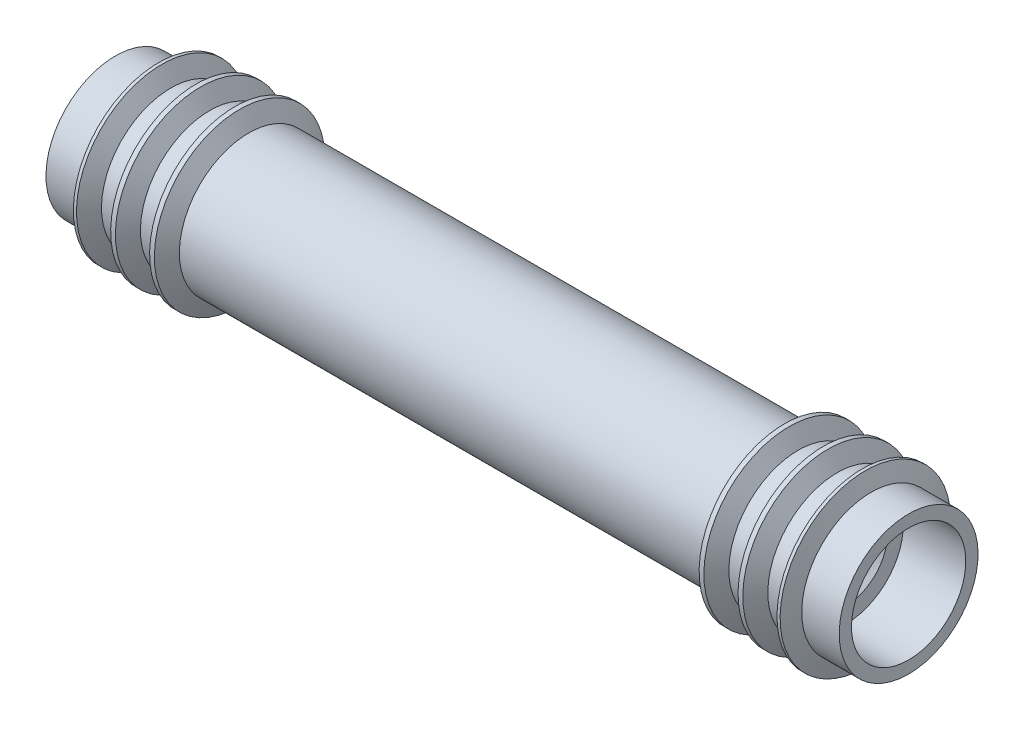
ISO-10303-21;
HEADER;
FILE_DESCRIPTION(('STEP AP214'),'2;1');
FILE_NAME('part.step','',(''),(''),'','','');
FILE_SCHEMA(('AUTOMOTIVE_DESIGN { 1 0 10303 214 1 1 1 1 }'));
ENDSEC;
DATA;
#1=APPLICATION_CONTEXT('core data for automotive mechanical design processes');
#2=APPLICATION_PROTOCOL_DEFINITION('international standard','automotive_design',2000,#1);
#3=PRODUCT_CONTEXT('',#1,'mechanical');
#4=PRODUCT('Part','Part','',(#3));
#5=PRODUCT_RELATED_PRODUCT_CATEGORY('part','',(#4));
#6=PRODUCT_DEFINITION_FORMATION('','',#4);
#7=PRODUCT_DEFINITION_CONTEXT('part definition',#1,'design');
#8=PRODUCT_DEFINITION('design','',#6,#7);
#9=PRODUCT_DEFINITION_SHAPE('','',#8);
#10=(LENGTH_UNIT() NAMED_UNIT(*) SI_UNIT(.MILLI.,.METRE.));
#11=(NAMED_UNIT(*) PLANE_ANGLE_UNIT() SI_UNIT($,.RADIAN.));
#12=(NAMED_UNIT(*) SI_UNIT($,.STERADIAN.) SOLID_ANGLE_UNIT());
#13=UNCERTAINTY_MEASURE_WITH_UNIT(LENGTH_MEASURE(1.E-05),#10,'distance_accuracy_value','');
#14=(GEOMETRIC_REPRESENTATION_CONTEXT(3) GLOBAL_UNCERTAINTY_ASSIGNED_CONTEXT((#13)) GLOBAL_UNIT_ASSIGNED_CONTEXT((#10,
#11,#12)) REPRESENTATION_CONTEXT('',''));
#15=CARTESIAN_POINT('',(0.,0.,0.));
#16=DIRECTION('',(0.,0.,1.));
#17=DIRECTION('',(1.,0.,0.));
#18=AXIS2_PLACEMENT_3D('',#15,#16,#17);
#19=CARTESIAN_POINT('',(-31.75,0.,0.));
#20=DIRECTION('',(-1.,0.,0.));
#21=DIRECTION('',(0.,-1.,0.));
#22=AXIS2_PLACEMENT_3D('',#19,#20,#21);
#23=CYLINDRICAL_SURFACE('',#22,5.55625);
#24=CARTESIAN_POINT('',(-21.0700606325167,0.,0.));
#25=DIRECTION('',(-1.,0.,0.));
#26=DIRECTION('',(0.,-1.,0.));
#27=AXIS2_PLACEMENT_3D('',#24,#25,#26);
#28=CIRCLE('',#27,5.55625);
#29=CARTESIAN_POINT('',(-21.0700606325167,-5.55625,0.));
#30=VERTEX_POINT('',#29);
#31=EDGE_CURVE('E61',#30,#30,#28,.T.);
#32=ORIENTED_EDGE('',*,*,#31,.F.);
#33=EDGE_LOOP('',(#32));
#34=FACE_BOUND('',#33,.T.);
#35=CARTESIAN_POINT('',(21.0700606325167,0.,0.));
#36=DIRECTION('',(-1.,0.,0.));
#37=DIRECTION('',(0.,-1.,0.));
#38=AXIS2_PLACEMENT_3D('',#35,#36,#37);
#39=CIRCLE('',#38,5.55625);
#40=CARTESIAN_POINT('',(21.0700606325167,-5.55625,0.));
#41=VERTEX_POINT('',#40);
#42=EDGE_CURVE('E136',#41,#41,#39,.T.);
#43=ORIENTED_EDGE('',*,*,#42,.T.);
#44=EDGE_LOOP('',(#43));
#45=FACE_BOUND('',#44,.T.);
#46=ADVANCED_FACE('F47',(#34,#45),#23,.T.);
#47=CARTESIAN_POINT('',(-21.8032954743875,0.,0.));
#48=DIRECTION('',(-1.,0.,0.));
#49=DIRECTION('',(0.,-1.,0.));
#50=AXIS2_PLACEMENT_3D('',#47,#48,#49);
#51=CONICAL_SURFACE('',#50,6.82625,1.0471975511966);
#52=ORIENTED_EDGE('',*,*,#31,.T.);
#53=EDGE_LOOP('',(#52));
#54=FACE_BOUND('',#53,.T.);
#55=CARTESIAN_POINT('',(-21.8032954743875,0.,0.));
#56=DIRECTION('',(-1.,0.,0.));
#57=DIRECTION('',(0.,-1.,0.));
#58=AXIS2_PLACEMENT_3D('',#55,#56,#57);
#59=CIRCLE('',#58,6.82625);
#60=CARTESIAN_POINT('',(-21.8032954743875,-6.82625,0.));
#61=VERTEX_POINT('',#60);
#62=EDGE_CURVE('E66',#61,#61,#59,.T.);
#63=ORIENTED_EDGE('',*,*,#62,.F.);
#64=EDGE_LOOP('',(#63));
#65=FACE_BOUND('',#64,.T.);
#66=ADVANCED_FACE('F228',(#54,#65),#51,.T.);
#67=CARTESIAN_POINT('',(-31.75,0.,0.));
#68=DIRECTION('',(-1.,0.,0.));
#69=DIRECTION('',(0.,-1.,0.));
#70=AXIS2_PLACEMENT_3D('',#67,#68,#69);
#71=CYLINDRICAL_SURFACE('',#70,6.82625);
#72=ORIENTED_EDGE('',*,*,#62,.T.);
#73=EDGE_LOOP('',(#72));
#74=FACE_BOUND('',#73,.T.);
#75=CARTESIAN_POINT('',(-22.1842954743875,0.,0.));
#76=DIRECTION('',(-1.,0.,0.));
#77=DIRECTION('',(0.,-1.,0.));
#78=AXIS2_PLACEMENT_3D('',#75,#76,#77);
#79=CIRCLE('',#78,6.82625);
#80=CARTESIAN_POINT('',(-22.1842954743875,-6.82625,0.));
#81=VERTEX_POINT('',#80);
#82=EDGE_CURVE('E72',#81,#81,#79,.T.);
#83=ORIENTED_EDGE('',*,*,#82,.F.);
#84=EDGE_LOOP('',(#83));
#85=FACE_BOUND('',#84,.T.);
#86=ADVANCED_FACE('F235',(#74,#85),#71,.T.);
#87=CARTESIAN_POINT('',(-22.9175303162584,0.,0.));
#88=DIRECTION('',(1.,0.,0.));
#89=DIRECTION('',(0.,1.,0.));
#90=AXIS2_PLACEMENT_3D('',#87,#88,#89);
#91=CONICAL_SURFACE('',#90,5.55625,1.0471975511966);
#92=ORIENTED_EDGE('',*,*,#82,.T.);
#93=EDGE_LOOP('',(#92));
#94=FACE_BOUND('',#93,.T.);
#95=CARTESIAN_POINT('',(-22.9175303162584,0.,0.));
#96=DIRECTION('',(-1.,0.,0.));
#97=DIRECTION('',(0.,-1.,0.));
#98=AXIS2_PLACEMENT_3D('',#95,#96,#97);
#99=CIRCLE('',#98,5.55625);
#100=CARTESIAN_POINT('',(-22.9175303162584,-5.55625,0.));
#101=VERTEX_POINT('',#100);
#102=EDGE_CURVE('E76',#101,#101,#99,.T.);
#103=ORIENTED_EDGE('',*,*,#102,.F.);
#104=EDGE_LOOP('',(#103));
#105=FACE_BOUND('',#104,.T.);
#106=ADVANCED_FACE('F243',(#94,#105),#91,.T.);
#107=CARTESIAN_POINT('',(-31.75,0.,0.));
#108=DIRECTION('',(-1.,0.,0.));
#109=DIRECTION('',(0.,-1.,0.));
#110=AXIS2_PLACEMENT_3D('',#107,#108,#109);
#111=CYLINDRICAL_SURFACE('',#110,5.55625);
#112=ORIENTED_EDGE('',*,*,#102,.T.);
#113=EDGE_LOOP('',(#112));
#114=FACE_BOUND('',#113,.T.);
#115=CARTESIAN_POINT('',(-24.1875303162583,0.,0.));
#116=DIRECTION('',(-1.,0.,0.));
#117=DIRECTION('',(0.,-1.,0.));
#118=AXIS2_PLACEMENT_3D('',#115,#116,#117);
#119=CIRCLE('',#118,5.55625);
#120=CARTESIAN_POINT('',(-24.1875303162583,-5.55625,0.));
#121=VERTEX_POINT('',#120);
#122=EDGE_CURVE('E80',#121,#121,#119,.T.);
#123=ORIENTED_EDGE('',*,*,#122,.F.);
#124=EDGE_LOOP('',(#123));
#125=FACE_BOUND('',#124,.T.);
#126=ADVANCED_FACE('F247',(#114,#125),#111,.T.);
#127=CARTESIAN_POINT('',(-24.9207651581292,0.,0.));
#128=DIRECTION('',(-1.,0.,0.));
#129=DIRECTION('',(0.,-1.,0.));
#130=AXIS2_PLACEMENT_3D('',#127,#128,#129);
#131=CONICAL_SURFACE('',#130,6.82625,1.0471975511966);
#132=ORIENTED_EDGE('',*,*,#122,.T.);
#133=EDGE_LOOP('',(#132));
#134=FACE_BOUND('',#133,.T.);
#135=CARTESIAN_POINT('',(-24.9207651581292,0.,0.));
#136=DIRECTION('',(-1.,0.,0.));
#137=DIRECTION('',(0.,-1.,0.));
#138=AXIS2_PLACEMENT_3D('',#135,#136,#137);
#139=CIRCLE('',#138,6.82625);
#140=CARTESIAN_POINT('',(-24.9207651581292,-6.82625,0.));
#141=VERTEX_POINT('',#140);
#142=EDGE_CURVE('E84',#141,#141,#139,.T.);
#143=ORIENTED_EDGE('',*,*,#142,.F.);
#144=EDGE_LOOP('',(#143));
#145=FACE_BOUND('',#144,.T.);
#146=ADVANCED_FACE('F251',(#134,#145),#131,.T.);
#147=CARTESIAN_POINT('',(-31.75,0.,0.));
#148=DIRECTION('',(-1.,0.,0.));
#149=DIRECTION('',(0.,-1.,0.));
#150=AXIS2_PLACEMENT_3D('',#147,#148,#149);
#151=CYLINDRICAL_SURFACE('',#150,6.82625);
#152=ORIENTED_EDGE('',*,*,#142,.T.);
#153=EDGE_LOOP('',(#152));
#154=FACE_BOUND('',#153,.T.);
#155=CARTESIAN_POINT('',(-25.3017651581292,0.,0.));
#156=DIRECTION('',(-1.,0.,0.));
#157=DIRECTION('',(0.,-1.,0.));
#158=AXIS2_PLACEMENT_3D('',#155,#156,#157);
#159=CIRCLE('',#158,6.82625);
#160=CARTESIAN_POINT('',(-25.3017651581292,-6.82625,0.));
#161=VERTEX_POINT('',#160);
#162=EDGE_CURVE('E88',#161,#161,#159,.T.);
#163=ORIENTED_EDGE('',*,*,#162,.F.);
#164=EDGE_LOOP('',(#163));
#165=FACE_BOUND('',#164,.T.);
#166=ADVANCED_FACE('F255',(#154,#165),#151,.T.);
#167=CARTESIAN_POINT('',(-25.3017651581292,0.,0.));
#168=DIRECTION('',(1.,0.,0.));
#169=DIRECTION('',(0.,1.,0.));
#170=AXIS2_PLACEMENT_3D('',#167,#168,#169);
#171=CONICAL_SURFACE('',#170,6.82625,1.0471975511966);
#172=CARTESIAN_POINT('',(-26.035,0.,0.));
#173=DIRECTION('',(-1.,0.,0.));
#174=DIRECTION('',(0.,-1.,0.));
#175=AXIS2_PLACEMENT_3D('',#172,#173,#174);
#176=CIRCLE('',#175,5.55625);
#177=CARTESIAN_POINT('',(-26.035,-5.55625,0.));
#178=VERTEX_POINT('',#177);
#179=EDGE_CURVE('E92',#178,#178,#176,.T.);
#180=ORIENTED_EDGE('',*,*,#179,.F.);
#181=EDGE_LOOP('',(#180));
#182=FACE_BOUND('',#181,.T.);
#183=ORIENTED_EDGE('',*,*,#162,.T.);
#184=EDGE_LOOP('',(#183));
#185=FACE_BOUND('',#184,.T.);
#186=ADVANCED_FACE('F259',(#182,#185),#171,.T.);
#187=CARTESIAN_POINT('',(-31.75,0.,0.));
#188=DIRECTION('',(-1.,0.,0.));
#189=DIRECTION('',(0.,-1.,0.));
#190=AXIS2_PLACEMENT_3D('',#187,#188,#189);
#191=CYLINDRICAL_SURFACE('',#190,5.55625);
#192=ORIENTED_EDGE('',*,*,#179,.T.);
#193=EDGE_LOOP('',(#192));
#194=FACE_BOUND('',#193,.T.);
#195=CARTESIAN_POINT('',(-27.305,0.,0.));
#196=DIRECTION('',(-1.,0.,0.));
#197=DIRECTION('',(0.,-1.,0.));
#198=AXIS2_PLACEMENT_3D('',#195,#196,#197);
#199=CIRCLE('',#198,5.55625);
#200=CARTESIAN_POINT('',(-27.305,-5.55625,0.));
#201=VERTEX_POINT('',#200);
#202=EDGE_CURVE('E96',#201,#201,#199,.T.);
#203=ORIENTED_EDGE('',*,*,#202,.F.);
#204=EDGE_LOOP('',(#203));
#205=FACE_BOUND('',#204,.T.);
#206=ADVANCED_FACE('F263',(#194,#205),#191,.T.);
#207=CARTESIAN_POINT('',(-28.0382348418708,0.,0.));
#208=DIRECTION('',(-1.,0.,0.));
#209=DIRECTION('',(0.,-1.,0.));
#210=AXIS2_PLACEMENT_3D('',#207,#208,#209);
#211=CONICAL_SURFACE('',#210,6.82625,1.0471975511966);
#212=ORIENTED_EDGE('',*,*,#202,.T.);
#213=EDGE_LOOP('',(#212));
#214=FACE_BOUND('',#213,.T.);
#215=CARTESIAN_POINT('',(-28.0382348418708,0.,0.));
#216=DIRECTION('',(-1.,0.,0.));
#217=DIRECTION('',(0.,-1.,0.));
#218=AXIS2_PLACEMENT_3D('',#215,#216,#217);
#219=CIRCLE('',#218,6.82625);
#220=CARTESIAN_POINT('',(-28.0382348418708,-6.82625,0.));
#221=VERTEX_POINT('',#220);
#222=EDGE_CURVE('E100',#221,#221,#219,.T.);
#223=ORIENTED_EDGE('',*,*,#222,.F.);
#224=EDGE_LOOP('',(#223));
#225=FACE_BOUND('',#224,.T.);
#226=ADVANCED_FACE('F267',(#214,#225),#211,.T.);
#227=CARTESIAN_POINT('',(-31.75,0.,0.));
#228=DIRECTION('',(-1.,0.,0.));
#229=DIRECTION('',(0.,-1.,0.));
#230=AXIS2_PLACEMENT_3D('',#227,#228,#229);
#231=CYLINDRICAL_SURFACE('',#230,6.82625);
#232=ORIENTED_EDGE('',*,*,#222,.T.);
#233=EDGE_LOOP('',(#232));
#234=FACE_BOUND('',#233,.T.);
#235=CARTESIAN_POINT('',(-28.2877578024819,0.,0.));
#236=DIRECTION('',(-1.,0.,0.));
#237=DIRECTION('',(0.,-1.,0.));
#238=AXIS2_PLACEMENT_3D('',#235,#236,#237);
#239=CIRCLE('',#238,6.82625);
#240=CARTESIAN_POINT('',(-28.2877578024819,-6.82625,0.));
#241=VERTEX_POINT('',#240);
#242=EDGE_CURVE('E104',#241,#241,#239,.T.);
#243=ORIENTED_EDGE('',*,*,#242,.F.);
#244=EDGE_LOOP('',(#243));
#245=FACE_BOUND('',#244,.T.);
#246=ADVANCED_FACE('F271',(#234,#245),#231,.T.);
#247=CARTESIAN_POINT('',(-28.75,0.,0.));
#248=DIRECTION('',(1.,0.,0.));
#249=DIRECTION('',(0.,1.,0.));
#250=AXIS2_PLACEMENT_3D('',#247,#248,#249);
#251=CONICAL_SURFACE('',#250,5.55625,1.22173047639603);
#252=ORIENTED_EDGE('',*,*,#242,.T.);
#253=EDGE_LOOP('',(#252));
#254=FACE_BOUND('',#253,.T.);
#255=CARTESIAN_POINT('',(-28.75,0.,0.));
#256=DIRECTION('',(-1.,0.,0.));
#257=DIRECTION('',(0.,-1.,0.));
#258=AXIS2_PLACEMENT_3D('',#255,#256,#257);
#259=CIRCLE('',#258,5.55625);
#260=CARTESIAN_POINT('',(-28.75,-5.55625,0.));
#261=VERTEX_POINT('',#260);
#262=EDGE_CURVE('E108',#261,#261,#259,.T.);
#263=ORIENTED_EDGE('',*,*,#262,.F.);
#264=EDGE_LOOP('',(#263));
#265=FACE_BOUND('',#264,.T.);
#266=ADVANCED_FACE('F275',(#254,#265),#251,.T.);
#267=CARTESIAN_POINT('',(-31.75,0.,0.));
#268=DIRECTION('',(-1.,0.,0.));
#269=DIRECTION('',(0.,-1.,0.));
#270=AXIS2_PLACEMENT_3D('',#267,#268,#269);
#271=CYLINDRICAL_SURFACE('',#270,5.55625);
#272=ORIENTED_EDGE('',*,*,#262,.T.);
#273=EDGE_LOOP('',(#272));
#274=FACE_BOUND('',#273,.T.);
#275=CARTESIAN_POINT('',(-31.75,0.,0.));
#276=DIRECTION('',(-1.,0.,0.));
#277=DIRECTION('',(0.,-1.,0.));
#278=AXIS2_PLACEMENT_3D('',#275,#276,#277);
#279=CIRCLE('',#278,5.55625);
#280=CARTESIAN_POINT('',(-31.75,-5.55625,0.));
#281=VERTEX_POINT('',#280);
#282=EDGE_CURVE('E112',#281,#281,#279,.T.);
#283=ORIENTED_EDGE('',*,*,#282,.F.);
#284=EDGE_LOOP('',(#283));
#285=FACE_BOUND('',#284,.T.);
#286=ADVANCED_FACE('F279',(#274,#285),#271,.T.);
#287=CARTESIAN_POINT('',(-31.75,0.,0.));
#288=DIRECTION('',(1.,0.,0.));
#289=DIRECTION('',(0.,1.,0.));
#290=AXIS2_PLACEMENT_3D('',#287,#288,#289);
#291=PLANE('',#290);
#292=CARTESIAN_POINT('',(-31.75,0.,0.));
#293=DIRECTION('',(1.,0.,0.));
#294=DIRECTION('',(0.,1.,0.));
#295=AXIS2_PLACEMENT_3D('',#292,#293,#294);
#296=CIRCLE('',#295,5.08299999999998);
#297=CARTESIAN_POINT('',(-31.75,5.08299999999998,0.));
#298=VERTEX_POINT('',#297);
#299=EDGE_CURVE('E10',#298,#298,#296,.T.);
#300=ORIENTED_EDGE('',*,*,#299,.T.);
#301=EDGE_LOOP('',(#300));
#302=FACE_BOUND('',#301,.T.);
#303=ORIENTED_EDGE('',*,*,#282,.T.);
#304=EDGE_LOOP('',(#303));
#305=FACE_BOUND('',#304,.T.);
#306=ADVANCED_FACE('F283',(#302,#305),#291,.F.);
#307=CARTESIAN_POINT('',(-31.75,0.,0.));
#308=DIRECTION('',(-1.,0.,0.));
#309=DIRECTION('',(0.,-1.,0.));
#310=AXIS2_PLACEMENT_3D('',#307,#308,#309);
#311=CYLINDRICAL_SURFACE('',#310,4.575);
#312=CARTESIAN_POINT('',(-31.242,0.,0.));
#313=DIRECTION('',(1.,0.,0.));
#314=DIRECTION('',(0.,1.,0.));
#315=AXIS2_PLACEMENT_3D('',#312,#313,#314);
#316=CIRCLE('',#315,4.575);
#317=CARTESIAN_POINT('',(-31.242,4.575,0.));
#318=VERTEX_POINT('',#317);
#319=EDGE_CURVE('E56',#318,#318,#316,.F.);
#320=ORIENTED_EDGE('',*,*,#319,.T.);
#321=EDGE_LOOP('',(#320));
#322=FACE_BOUND('',#321,.T.);
#323=CARTESIAN_POINT('',(-26.75,0.,0.));
#324=DIRECTION('',(-1.,0.,0.));
#325=DIRECTION('',(0.,-1.,0.));
#326=AXIS2_PLACEMENT_3D('',#323,#324,#325);
#327=CIRCLE('',#326,4.575);
#328=CARTESIAN_POINT('',(-26.75,-4.575,0.));
#329=VERTEX_POINT('',#328);
#330=EDGE_CURVE('E116',#329,#329,#327,.T.);
#331=ORIENTED_EDGE('',*,*,#330,.F.);
#332=EDGE_LOOP('',(#331));
#333=FACE_BOUND('',#332,.T.);
#334=ADVANCED_FACE('F286',(#322,#333),#311,.F.);
#335=CARTESIAN_POINT('',(-26.75,0.,0.));
#336=DIRECTION('',(1.,0.,0.));
#337=DIRECTION('',(0.,1.,0.));
#338=AXIS2_PLACEMENT_3D('',#335,#336,#337);
#339=PLANE('',#338);
#340=CARTESIAN_POINT('',(-26.75,0.,0.));
#341=DIRECTION('',(-1.,0.,0.));
#342=DIRECTION('',(0.,-1.,0.));
#343=AXIS2_PLACEMENT_3D('',#340,#341,#342);
#344=CIRCLE('',#343,3.305);
#345=CARTESIAN_POINT('',(-26.75,-3.305,0.));
#346=VERTEX_POINT('',#345);
#347=EDGE_CURVE('E120',#346,#346,#344,.T.);
#348=ORIENTED_EDGE('',*,*,#347,.F.);
#349=EDGE_LOOP('',(#348));
#350=FACE_BOUND('',#349,.T.);
#351=ORIENTED_EDGE('',*,*,#330,.T.);
#352=EDGE_LOOP('',(#351));
#353=FACE_BOUND('',#352,.T.);
#354=ADVANCED_FACE('F289',(#350,#353),#339,.F.);
#355=CARTESIAN_POINT('',(-26.75,0.,0.));
#356=DIRECTION('',(-1.,0.,0.));
#357=DIRECTION('',(0.,-1.,0.));
#358=AXIS2_PLACEMENT_3D('',#355,#356,#357);
#359=CONICAL_SURFACE('',#358,3.305,0.785398163397449);
#360=CARTESIAN_POINT('',(-26.242,0.,0.));
#361=DIRECTION('',(-1.,0.,0.));
#362=DIRECTION('',(0.,-1.,0.));
#363=AXIS2_PLACEMENT_3D('',#360,#361,#362);
#364=CIRCLE('',#363,2.797);
#365=CARTESIAN_POINT('',(-26.242,-2.797,0.));
#366=VERTEX_POINT('',#365);
#367=EDGE_CURVE('E124',#366,#366,#364,.T.);
#368=ORIENTED_EDGE('',*,*,#367,.F.);
#369=EDGE_LOOP('',(#368));
#370=FACE_BOUND('',#369,.T.);
#371=ORIENTED_EDGE('',*,*,#347,.T.);
#372=EDGE_LOOP('',(#371));
#373=FACE_BOUND('',#372,.T.);
#374=ADVANCED_FACE('F292',(#370,#373),#359,.F.);
#375=CARTESIAN_POINT('',(-26.242,0.,0.));
#376=DIRECTION('',(1.,0.,0.));
#377=DIRECTION('',(0.,1.,0.));
#378=AXIS2_PLACEMENT_3D('',#375,#376,#377);
#379=PLANE('',#378);
#380=CARTESIAN_POINT('',(-26.242,0.,0.));
#381=DIRECTION('',(-1.,0.,0.));
#382=DIRECTION('',(0.,-1.,0.));
#383=AXIS2_PLACEMENT_3D('',#380,#381,#382);
#384=CIRCLE('',#383,1.7145);
#385=CARTESIAN_POINT('',(-26.242,-1.7145,0.));
#386=VERTEX_POINT('',#385);
#387=EDGE_CURVE('E128',#386,#386,#384,.T.);
#388=ORIENTED_EDGE('',*,*,#387,.F.);
#389=EDGE_LOOP('',(#388));
#390=FACE_BOUND('',#389,.T.);
#391=ORIENTED_EDGE('',*,*,#367,.T.);
#392=EDGE_LOOP('',(#391));
#393=FACE_BOUND('',#392,.T.);
#394=ADVANCED_FACE('F296',(#390,#393),#379,.F.);
#395=CARTESIAN_POINT('',(-31.75,0.,0.));
#396=DIRECTION('',(-1.,0.,0.));
#397=DIRECTION('',(0.,-1.,0.));
#398=AXIS2_PLACEMENT_3D('',#395,#396,#397);
#399=CYLINDRICAL_SURFACE('',#398,1.7145);
#400=CARTESIAN_POINT('',(-21.925,0.,0.));
#401=DIRECTION('',(-1.,0.,0.));
#402=DIRECTION('',(0.,-1.,0.));
#403=AXIS2_PLACEMENT_3D('',#400,#401,#402);
#404=CIRCLE('',#403,1.7145);
#405=CARTESIAN_POINT('',(-21.925,-1.7145,0.));
#406=VERTEX_POINT('',#405);
#407=EDGE_CURVE('E132',#406,#406,#404,.T.);
#408=ORIENTED_EDGE('',*,*,#407,.F.);
#409=EDGE_LOOP('',(#408));
#410=FACE_BOUND('',#409,.T.);
#411=ORIENTED_EDGE('',*,*,#387,.T.);
#412=EDGE_LOOP('',(#411));
#413=FACE_BOUND('',#412,.T.);
#414=ADVANCED_FACE('F300',(#410,#413),#399,.F.);
#415=CARTESIAN_POINT('',(-21.925,0.,0.));
#416=DIRECTION('',(1.,0.,0.));
#417=DIRECTION('',(0.,1.,0.));
#418=AXIS2_PLACEMENT_3D('',#415,#416,#417);
#419=PLANE('',#418);
#420=ORIENTED_EDGE('',*,*,#407,.T.);
#421=EDGE_LOOP('',(#420));
#422=FACE_BOUND('',#421,.T.);
#423=ADVANCED_FACE('F304',(#422),#419,.F.);
#424=CARTESIAN_POINT('',(21.8032954743875,0.,0.));
#425=DIRECTION('',(1.,0.,0.));
#426=DIRECTION('',(0.,-1.,0.));
#427=AXIS2_PLACEMENT_3D('',#424,#425,#426);
#428=CONICAL_SURFACE('',#427,6.82625,1.0471975511966);
#429=ORIENTED_EDGE('',*,*,#42,.F.);
#430=EDGE_LOOP('',(#429));
#431=FACE_BOUND('',#430,.T.);
#432=CARTESIAN_POINT('',(21.8032954743875,0.,0.));
#433=DIRECTION('',(-1.,0.,0.));
#434=DIRECTION('',(0.,-1.,0.));
#435=AXIS2_PLACEMENT_3D('',#432,#433,#434);
#436=CIRCLE('',#435,6.82625);
#437=CARTESIAN_POINT('',(21.8032954743875,-6.82625,0.));
#438=VERTEX_POINT('',#437);
#439=EDGE_CURVE('E140',#438,#438,#436,.T.);
#440=ORIENTED_EDGE('',*,*,#439,.T.);
#441=EDGE_LOOP('',(#440));
#442=FACE_BOUND('',#441,.T.);
#443=ADVANCED_FACE('F308',(#431,#442),#428,.T.);
#444=CARTESIAN_POINT('',(31.75,0.,0.));
#445=DIRECTION('',(1.,0.,0.));
#446=DIRECTION('',(0.,-1.,0.));
#447=AXIS2_PLACEMENT_3D('',#444,#445,#446);
#448=CYLINDRICAL_SURFACE('',#447,6.82625);
#449=ORIENTED_EDGE('',*,*,#439,.F.);
#450=EDGE_LOOP('',(#449));
#451=FACE_BOUND('',#450,.T.);
#452=CARTESIAN_POINT('',(22.1842954743875,0.,0.));
#453=DIRECTION('',(-1.,0.,0.));
#454=DIRECTION('',(0.,-1.,0.));
#455=AXIS2_PLACEMENT_3D('',#452,#453,#454);
#456=CIRCLE('',#455,6.82625);
#457=CARTESIAN_POINT('',(22.1842954743875,-6.82625,0.));
#458=VERTEX_POINT('',#457);
#459=EDGE_CURVE('E144',#458,#458,#456,.T.);
#460=ORIENTED_EDGE('',*,*,#459,.T.);
#461=EDGE_LOOP('',(#460));
#462=FACE_BOUND('',#461,.T.);
#463=ADVANCED_FACE('F311',(#451,#462),#448,.T.);
#464=CARTESIAN_POINT('',(22.9175303162584,0.,0.));
#465=DIRECTION('',(-1.,0.,0.));
#466=DIRECTION('',(0.,1.,0.));
#467=AXIS2_PLACEMENT_3D('',#464,#465,#466);
#468=CONICAL_SURFACE('',#467,5.55625,1.0471975511966);
#469=ORIENTED_EDGE('',*,*,#459,.F.);
#470=EDGE_LOOP('',(#469));
#471=FACE_BOUND('',#470,.T.);
#472=CARTESIAN_POINT('',(22.9175303162584,0.,0.));
#473=DIRECTION('',(-1.,0.,0.));
#474=DIRECTION('',(0.,-1.,0.));
#475=AXIS2_PLACEMENT_3D('',#472,#473,#474);
#476=CIRCLE('',#475,5.55625);
#477=CARTESIAN_POINT('',(22.9175303162584,-5.55625,0.));
#478=VERTEX_POINT('',#477);
#479=EDGE_CURVE('E148',#478,#478,#476,.T.);
#480=ORIENTED_EDGE('',*,*,#479,.T.);
#481=EDGE_LOOP('',(#480));
#482=FACE_BOUND('',#481,.T.);
#483=ADVANCED_FACE('F315',(#471,#482),#468,.T.);
#484=CARTESIAN_POINT('',(31.75,0.,0.));
#485=DIRECTION('',(1.,0.,0.));
#486=DIRECTION('',(0.,-1.,0.));
#487=AXIS2_PLACEMENT_3D('',#484,#485,#486);
#488=CYLINDRICAL_SURFACE('',#487,5.55625);
#489=ORIENTED_EDGE('',*,*,#479,.F.);
#490=EDGE_LOOP('',(#489));
#491=FACE_BOUND('',#490,.T.);
#492=CARTESIAN_POINT('',(24.1875303162583,0.,0.));
#493=DIRECTION('',(-1.,0.,0.));
#494=DIRECTION('',(0.,-1.,0.));
#495=AXIS2_PLACEMENT_3D('',#492,#493,#494);
#496=CIRCLE('',#495,5.55625);
#497=CARTESIAN_POINT('',(24.1875303162583,-5.55625,0.));
#498=VERTEX_POINT('',#497);
#499=EDGE_CURVE('E152',#498,#498,#496,.T.);
#500=ORIENTED_EDGE('',*,*,#499,.T.);
#501=EDGE_LOOP('',(#500));
#502=FACE_BOUND('',#501,.T.);
#503=ADVANCED_FACE('F319',(#491,#502),#488,.T.);
#504=CARTESIAN_POINT('',(24.9207651581292,0.,0.));
#505=DIRECTION('',(1.,0.,0.));
#506=DIRECTION('',(0.,-1.,0.));
#507=AXIS2_PLACEMENT_3D('',#504,#505,#506);
#508=CONICAL_SURFACE('',#507,6.82625,1.0471975511966);
#509=ORIENTED_EDGE('',*,*,#499,.F.);
#510=EDGE_LOOP('',(#509));
#511=FACE_BOUND('',#510,.T.);
#512=CARTESIAN_POINT('',(24.9207651581292,0.,0.));
#513=DIRECTION('',(-1.,0.,0.));
#514=DIRECTION('',(0.,-1.,0.));
#515=AXIS2_PLACEMENT_3D('',#512,#513,#514);
#516=CIRCLE('',#515,6.82625);
#517=CARTESIAN_POINT('',(24.9207651581292,-6.82625,0.));
#518=VERTEX_POINT('',#517);
#519=EDGE_CURVE('E156',#518,#518,#516,.T.);
#520=ORIENTED_EDGE('',*,*,#519,.T.);
#521=EDGE_LOOP('',(#520));
#522=FACE_BOUND('',#521,.T.);
#523=ADVANCED_FACE('F323',(#511,#522),#508,.T.);
#524=CARTESIAN_POINT('',(31.75,0.,0.));
#525=DIRECTION('',(1.,0.,0.));
#526=DIRECTION('',(0.,-1.,0.));
#527=AXIS2_PLACEMENT_3D('',#524,#525,#526);
#528=CYLINDRICAL_SURFACE('',#527,6.82625);
#529=ORIENTED_EDGE('',*,*,#519,.F.);
#530=EDGE_LOOP('',(#529));
#531=FACE_BOUND('',#530,.T.);
#532=CARTESIAN_POINT('',(25.3017651581292,0.,0.));
#533=DIRECTION('',(-1.,0.,0.));
#534=DIRECTION('',(0.,-1.,0.));
#535=AXIS2_PLACEMENT_3D('',#532,#533,#534);
#536=CIRCLE('',#535,6.82625);
#537=CARTESIAN_POINT('',(25.3017651581292,-6.82625,0.));
#538=VERTEX_POINT('',#537);
#539=EDGE_CURVE('E160',#538,#538,#536,.T.);
#540=ORIENTED_EDGE('',*,*,#539,.T.);
#541=EDGE_LOOP('',(#540));
#542=FACE_BOUND('',#541,.T.);
#543=ADVANCED_FACE('F327',(#531,#542),#528,.T.);
#544=CARTESIAN_POINT('',(25.3017651581292,0.,0.));
#545=DIRECTION('',(-1.,0.,0.));
#546=DIRECTION('',(0.,1.,0.));
#547=AXIS2_PLACEMENT_3D('',#544,#545,#546);
#548=CONICAL_SURFACE('',#547,6.82625,1.0471975511966);
#549=CARTESIAN_POINT('',(26.035,0.,0.));
#550=DIRECTION('',(-1.,0.,0.));
#551=DIRECTION('',(0.,-1.,0.));
#552=AXIS2_PLACEMENT_3D('',#549,#550,#551);
#553=CIRCLE('',#552,5.55625);
#554=CARTESIAN_POINT('',(26.035,-5.55625,0.));
#555=VERTEX_POINT('',#554);
#556=EDGE_CURVE('E164',#555,#555,#553,.T.);
#557=ORIENTED_EDGE('',*,*,#556,.T.);
#558=EDGE_LOOP('',(#557));
#559=FACE_BOUND('',#558,.T.);
#560=ORIENTED_EDGE('',*,*,#539,.F.);
#561=EDGE_LOOP('',(#560));
#562=FACE_BOUND('',#561,.T.);
#563=ADVANCED_FACE('F331',(#559,#562),#548,.T.);
#564=CARTESIAN_POINT('',(31.75,0.,0.));
#565=DIRECTION('',(1.,0.,0.));
#566=DIRECTION('',(0.,-1.,0.));
#567=AXIS2_PLACEMENT_3D('',#564,#565,#566);
#568=CYLINDRICAL_SURFACE('',#567,5.55625);
#569=ORIENTED_EDGE('',*,*,#556,.F.);
#570=EDGE_LOOP('',(#569));
#571=FACE_BOUND('',#570,.T.);
#572=CARTESIAN_POINT('',(27.305,0.,0.));
#573=DIRECTION('',(-1.,0.,0.));
#574=DIRECTION('',(0.,-1.,0.));
#575=AXIS2_PLACEMENT_3D('',#572,#573,#574);
#576=CIRCLE('',#575,5.55625);
#577=CARTESIAN_POINT('',(27.305,-5.55625,0.));
#578=VERTEX_POINT('',#577);
#579=EDGE_CURVE('E168',#578,#578,#576,.T.);
#580=ORIENTED_EDGE('',*,*,#579,.T.);
#581=EDGE_LOOP('',(#580));
#582=FACE_BOUND('',#581,.T.);
#583=ADVANCED_FACE('F335',(#571,#582),#568,.T.);
#584=CARTESIAN_POINT('',(28.0382348418708,0.,0.));
#585=DIRECTION('',(1.,0.,0.));
#586=DIRECTION('',(0.,-1.,0.));
#587=AXIS2_PLACEMENT_3D('',#584,#585,#586);
#588=CONICAL_SURFACE('',#587,6.82625,1.0471975511966);
#589=ORIENTED_EDGE('',*,*,#579,.F.);
#590=EDGE_LOOP('',(#589));
#591=FACE_BOUND('',#590,.T.);
#592=CARTESIAN_POINT('',(28.0382348418708,0.,0.));
#593=DIRECTION('',(-1.,0.,0.));
#594=DIRECTION('',(0.,-1.,0.));
#595=AXIS2_PLACEMENT_3D('',#592,#593,#594);
#596=CIRCLE('',#595,6.82625);
#597=CARTESIAN_POINT('',(28.0382348418708,-6.82625,0.));
#598=VERTEX_POINT('',#597);
#599=EDGE_CURVE('E172',#598,#598,#596,.T.);
#600=ORIENTED_EDGE('',*,*,#599,.T.);
#601=EDGE_LOOP('',(#600));
#602=FACE_BOUND('',#601,.T.);
#603=ADVANCED_FACE('F339',(#591,#602),#588,.T.);
#604=CARTESIAN_POINT('',(31.75,0.,0.));
#605=DIRECTION('',(1.,0.,0.));
#606=DIRECTION('',(0.,-1.,0.));
#607=AXIS2_PLACEMENT_3D('',#604,#605,#606);
#608=CYLINDRICAL_SURFACE('',#607,6.82625);
#609=ORIENTED_EDGE('',*,*,#599,.F.);
#610=EDGE_LOOP('',(#609));
#611=FACE_BOUND('',#610,.T.);
#612=CARTESIAN_POINT('',(28.2877578024819,0.,0.));
#613=DIRECTION('',(-1.,0.,0.));
#614=DIRECTION('',(0.,-1.,0.));
#615=AXIS2_PLACEMENT_3D('',#612,#613,#614);
#616=CIRCLE('',#615,6.82625);
#617=CARTESIAN_POINT('',(28.2877578024819,-6.82625,0.));
#618=VERTEX_POINT('',#617);
#619=EDGE_CURVE('E176',#618,#618,#616,.T.);
#620=ORIENTED_EDGE('',*,*,#619,.T.);
#621=EDGE_LOOP('',(#620));
#622=FACE_BOUND('',#621,.T.);
#623=ADVANCED_FACE('F343',(#611,#622),#608,.T.);
#624=CARTESIAN_POINT('',(28.75,0.,0.));
#625=DIRECTION('',(-1.,0.,0.));
#626=DIRECTION('',(0.,1.,0.));
#627=AXIS2_PLACEMENT_3D('',#624,#625,#626);
#628=CONICAL_SURFACE('',#627,5.55625,1.22173047639603);
#629=ORIENTED_EDGE('',*,*,#619,.F.);
#630=EDGE_LOOP('',(#629));
#631=FACE_BOUND('',#630,.T.);
#632=CARTESIAN_POINT('',(28.75,0.,0.));
#633=DIRECTION('',(-1.,0.,0.));
#634=DIRECTION('',(0.,-1.,0.));
#635=AXIS2_PLACEMENT_3D('',#632,#633,#634);
#636=CIRCLE('',#635,5.55625);
#637=CARTESIAN_POINT('',(28.75,-5.55625,0.));
#638=VERTEX_POINT('',#637);
#639=EDGE_CURVE('E180',#638,#638,#636,.T.);
#640=ORIENTED_EDGE('',*,*,#639,.T.);
#641=EDGE_LOOP('',(#640));
#642=FACE_BOUND('',#641,.T.);
#643=ADVANCED_FACE('F347',(#631,#642),#628,.T.);
#644=CARTESIAN_POINT('',(31.75,0.,0.));
#645=DIRECTION('',(1.,0.,0.));
#646=DIRECTION('',(0.,-1.,0.));
#647=AXIS2_PLACEMENT_3D('',#644,#645,#646);
#648=CYLINDRICAL_SURFACE('',#647,5.55625);
#649=ORIENTED_EDGE('',*,*,#639,.F.);
#650=EDGE_LOOP('',(#649));
#651=FACE_BOUND('',#650,.T.);
#652=CARTESIAN_POINT('',(31.75,0.,0.));
#653=DIRECTION('',(-1.,0.,0.));
#654=DIRECTION('',(0.,-1.,0.));
#655=AXIS2_PLACEMENT_3D('',#652,#653,#654);
#656=CIRCLE('',#655,5.55625);
#657=CARTESIAN_POINT('',(31.75,-5.55625,0.));
#658=VERTEX_POINT('',#657);
#659=EDGE_CURVE('E184',#658,#658,#656,.T.);
#660=ORIENTED_EDGE('',*,*,#659,.T.);
#661=EDGE_LOOP('',(#660));
#662=FACE_BOUND('',#661,.T.);
#663=ADVANCED_FACE('F351',(#651,#662),#648,.T.);
#664=CARTESIAN_POINT('',(31.75,0.,0.));
#665=DIRECTION('',(-1.,0.,0.));
#666=DIRECTION('',(0.,1.,0.));
#667=AXIS2_PLACEMENT_3D('',#664,#665,#666);
#668=PLANE('',#667);
#669=CARTESIAN_POINT('',(31.75,0.,0.));
#670=DIRECTION('',(-1.,0.,0.));
#671=DIRECTION('',(0.,-1.,0.));
#672=AXIS2_PLACEMENT_3D('',#669,#670,#671);
#673=CIRCLE('',#672,4.575);
#674=CARTESIAN_POINT('',(31.75,-4.575,0.));
#675=VERTEX_POINT('',#674);
#676=EDGE_CURVE('E188',#675,#675,#673,.T.);
#677=ORIENTED_EDGE('',*,*,#676,.T.);
#678=EDGE_LOOP('',(#677));
#679=FACE_BOUND('',#678,.T.);
#680=ORIENTED_EDGE('',*,*,#659,.F.);
#681=EDGE_LOOP('',(#680));
#682=FACE_BOUND('',#681,.T.);
#683=ADVANCED_FACE('F355',(#679,#682),#668,.F.);
#684=CARTESIAN_POINT('',(31.75,0.,0.));
#685=DIRECTION('',(1.,0.,0.));
#686=DIRECTION('',(0.,-1.,0.));
#687=AXIS2_PLACEMENT_3D('',#684,#685,#686);
#688=CYLINDRICAL_SURFACE('',#687,4.575);
#689=CARTESIAN_POINT('',(26.75,0.,0.));
#690=DIRECTION('',(-1.,0.,0.));
#691=DIRECTION('',(0.,-1.,0.));
#692=AXIS2_PLACEMENT_3D('',#689,#690,#691);
#693=CIRCLE('',#692,4.575);
#694=CARTESIAN_POINT('',(26.75,-4.575,0.));
#695=VERTEX_POINT('',#694);
#696=EDGE_CURVE('E192',#695,#695,#693,.T.);
#697=ORIENTED_EDGE('',*,*,#696,.T.);
#698=EDGE_LOOP('',(#697));
#699=FACE_BOUND('',#698,.T.);
#700=ORIENTED_EDGE('',*,*,#676,.F.);
#701=EDGE_LOOP('',(#700));
#702=FACE_BOUND('',#701,.T.);
#703=ADVANCED_FACE('F359',(#699,#702),#688,.F.);
#704=CARTESIAN_POINT('',(26.75,0.,0.));
#705=DIRECTION('',(-1.,0.,0.));
#706=DIRECTION('',(0.,1.,0.));
#707=AXIS2_PLACEMENT_3D('',#704,#705,#706);
#708=PLANE('',#707);
#709=CARTESIAN_POINT('',(26.75,0.,0.));
#710=DIRECTION('',(-1.,0.,0.));
#711=DIRECTION('',(0.,-1.,0.));
#712=AXIS2_PLACEMENT_3D('',#709,#710,#711);
#713=CIRCLE('',#712,3.305);
#714=CARTESIAN_POINT('',(26.75,-3.305,0.));
#715=VERTEX_POINT('',#714);
#716=EDGE_CURVE('E196',#715,#715,#713,.T.);
#717=ORIENTED_EDGE('',*,*,#716,.T.);
#718=EDGE_LOOP('',(#717));
#719=FACE_BOUND('',#718,.T.);
#720=ORIENTED_EDGE('',*,*,#696,.F.);
#721=EDGE_LOOP('',(#720));
#722=FACE_BOUND('',#721,.T.);
#723=ADVANCED_FACE('F363',(#719,#722),#708,.F.);
#724=CARTESIAN_POINT('',(26.75,0.,0.));
#725=DIRECTION('',(1.,0.,0.));
#726=DIRECTION('',(0.,-1.,0.));
#727=AXIS2_PLACEMENT_3D('',#724,#725,#726);
#728=CONICAL_SURFACE('',#727,3.305,0.785398163397449);
#729=CARTESIAN_POINT('',(26.242,0.,0.));
#730=DIRECTION('',(-1.,0.,0.));
#731=DIRECTION('',(0.,-1.,0.));
#732=AXIS2_PLACEMENT_3D('',#729,#730,#731);
#733=CIRCLE('',#732,2.797);
#734=CARTESIAN_POINT('',(26.242,-2.797,0.));
#735=VERTEX_POINT('',#734);
#736=EDGE_CURVE('E200',#735,#735,#733,.T.);
#737=ORIENTED_EDGE('',*,*,#736,.T.);
#738=EDGE_LOOP('',(#737));
#739=FACE_BOUND('',#738,.T.);
#740=ORIENTED_EDGE('',*,*,#716,.F.);
#741=EDGE_LOOP('',(#740));
#742=FACE_BOUND('',#741,.T.);
#743=ADVANCED_FACE('F367',(#739,#742),#728,.F.);
#744=CARTESIAN_POINT('',(26.242,0.,0.));
#745=DIRECTION('',(-1.,0.,0.));
#746=DIRECTION('',(0.,1.,0.));
#747=AXIS2_PLACEMENT_3D('',#744,#745,#746);
#748=PLANE('',#747);
#749=CARTESIAN_POINT('',(26.242,0.,0.));
#750=DIRECTION('',(-1.,0.,0.));
#751=DIRECTION('',(0.,-1.,0.));
#752=AXIS2_PLACEMENT_3D('',#749,#750,#751);
#753=CIRCLE('',#752,1.7145);
#754=CARTESIAN_POINT('',(26.242,-1.7145,0.));
#755=VERTEX_POINT('',#754);
#756=EDGE_CURVE('E204',#755,#755,#753,.T.);
#757=ORIENTED_EDGE('',*,*,#756,.T.);
#758=EDGE_LOOP('',(#757));
#759=FACE_BOUND('',#758,.T.);
#760=ORIENTED_EDGE('',*,*,#736,.F.);
#761=EDGE_LOOP('',(#760));
#762=FACE_BOUND('',#761,.T.);
#763=ADVANCED_FACE('F225',(#759,#762),#748,.F.);
#764=CARTESIAN_POINT('',(31.75,0.,0.));
#765=DIRECTION('',(1.,0.,0.));
#766=DIRECTION('',(0.,-1.,0.));
#767=AXIS2_PLACEMENT_3D('',#764,#765,#766);
#768=CYLINDRICAL_SURFACE('',#767,1.7145);
#769=CARTESIAN_POINT('',(21.925,0.,0.));
#770=DIRECTION('',(-1.,0.,0.));
#771=DIRECTION('',(0.,-1.,0.));
#772=AXIS2_PLACEMENT_3D('',#769,#770,#771);
#773=CIRCLE('',#772,1.7145);
#774=CARTESIAN_POINT('',(21.925,-1.7145,0.));
#775=VERTEX_POINT('',#774);
#776=EDGE_CURVE('E208',#775,#775,#773,.T.);
#777=ORIENTED_EDGE('',*,*,#776,.T.);
#778=EDGE_LOOP('',(#777));
#779=FACE_BOUND('',#778,.T.);
#780=ORIENTED_EDGE('',*,*,#756,.F.);
#781=EDGE_LOOP('',(#780));
#782=FACE_BOUND('',#781,.T.);
#783=ADVANCED_FACE('F213',(#779,#782),#768,.F.);
#784=CARTESIAN_POINT('',(21.925,0.,0.));
#785=DIRECTION('',(-1.,0.,0.));
#786=DIRECTION('',(0.,1.,0.));
#787=AXIS2_PLACEMENT_3D('',#784,#785,#786);
#788=PLANE('',#787);
#789=ORIENTED_EDGE('',*,*,#776,.F.);
#790=EDGE_LOOP('',(#789));
#791=FACE_BOUND('',#790,.T.);
#792=ADVANCED_FACE('F216',(#791),#788,.F.);
#793=CARTESIAN_POINT('',(-31.242,0.,0.));
#794=DIRECTION('',(-1.,0.,0.));
#795=DIRECTION('',(0.,-1.,0.));
#796=AXIS2_PLACEMENT_3D('',#793,#794,#795);
#797=CONICAL_SURFACE('',#796,4.575,0.785398163397442);
#798=ORIENTED_EDGE('',*,*,#299,.F.);
#799=EDGE_LOOP('',(#798));
#800=FACE_BOUND('',#799,.T.);
#801=ORIENTED_EDGE('',*,*,#319,.F.);
#802=EDGE_LOOP('',(#801));
#803=FACE_BOUND('',#802,.T.);
#804=ADVANCED_FACE('F50',(#800,#803),#797,.F.);
#805=CLOSED_SHELL('',(#46,#66,#86,#106,#126,#146,#166,#186,#206,#226,#246,#266,#286,#306,#334,
#354,#374,#394,#414,#423,#443,#463,#483,#503,#523,#543,#563,#583,#603,#623,#643,#663,#683,#703,
#723,#743,#763,#783,#792,#804));
#806=MANIFOLD_SOLID_BREP('B2',#805);
#807=ADVANCED_BREP_SHAPE_REPRESENTATION('',(#18,#806),#14);
#808=SHAPE_DEFINITION_REPRESENTATION(#9,#807);
ENDSEC;
END-ISO-10303-21;
